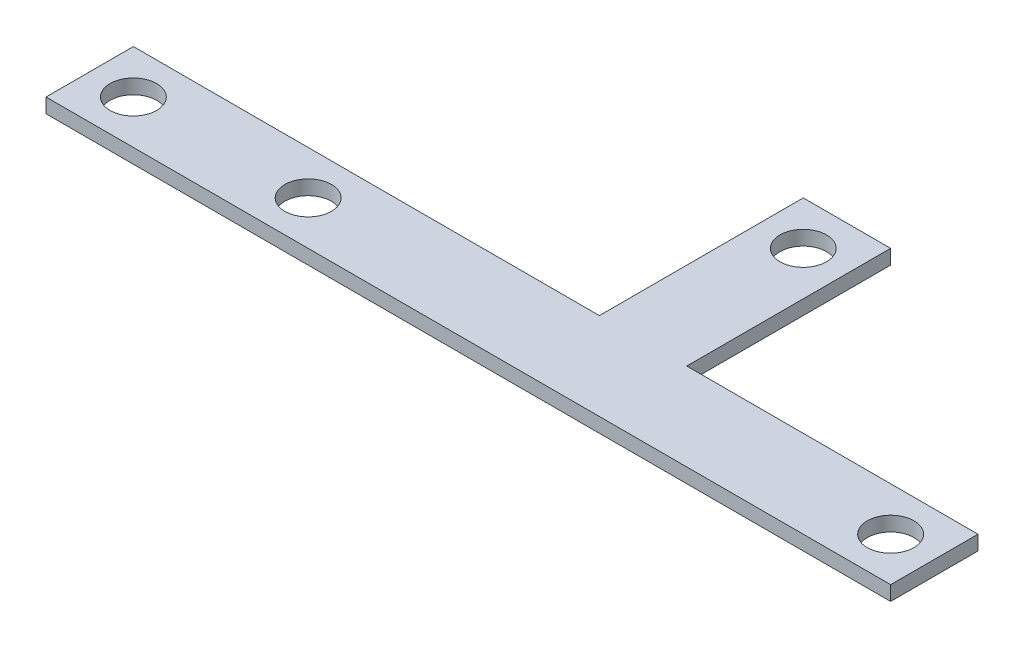
ISO-10303-21;
HEADER;
FILE_DESCRIPTION(('STEP AP214'),'2;1');
FILE_NAME('part.step','',(''),(''),'','','');
FILE_SCHEMA(('AUTOMOTIVE_DESIGN { 1 0 10303 214 1 1 1 1 }'));
ENDSEC;
DATA;
#1=APPLICATION_CONTEXT('core data for automotive mechanical design processes');
#2=APPLICATION_PROTOCOL_DEFINITION('international standard','automotive_design',2000,#1);
#3=PRODUCT_CONTEXT('',#1,'mechanical');
#4=PRODUCT('Part','Part','',(#3));
#5=PRODUCT_RELATED_PRODUCT_CATEGORY('part','',(#4));
#6=PRODUCT_DEFINITION_FORMATION('','',#4);
#7=PRODUCT_DEFINITION_CONTEXT('part definition',#1,'design');
#8=PRODUCT_DEFINITION('design','',#6,#7);
#9=PRODUCT_DEFINITION_SHAPE('','',#8);
#10=(LENGTH_UNIT() NAMED_UNIT(*) SI_UNIT(.MILLI.,.METRE.));
#11=(NAMED_UNIT(*) PLANE_ANGLE_UNIT() SI_UNIT($,.RADIAN.));
#12=(NAMED_UNIT(*) SI_UNIT($,.STERADIAN.) SOLID_ANGLE_UNIT());
#13=UNCERTAINTY_MEASURE_WITH_UNIT(LENGTH_MEASURE(1.E-05),#10,'distance_accuracy_value','');
#14=(GEOMETRIC_REPRESENTATION_CONTEXT(3) GLOBAL_UNCERTAINTY_ASSIGNED_CONTEXT((#13)) GLOBAL_UNIT_ASSIGNED_CONTEXT((#10,
#11,#12)) REPRESENTATION_CONTEXT('',''));
#15=CARTESIAN_POINT('',(0.,0.,0.));
#16=DIRECTION('',(0.,0.,1.));
#17=DIRECTION('',(1.,0.,0.));
#18=AXIS2_PLACEMENT_3D('',#15,#16,#17);
#19=CARTESIAN_POINT('',(0.,5.,0.));
#20=DIRECTION('',(0.,0.,-1.));
#21=DIRECTION('',(-1.,0.,0.));
#22=AXIS2_PLACEMENT_3D('',#19,#20,#21);
#23=PLANE('',#22);
#24=DIRECTION('',(1.,0.,0.));
#25=VECTOR('',#24,1.);
#26=CARTESIAN_POINT('',(0.,0.,0.));
#27=LINE('',#26,#25);
#28=CARTESIAN_POINT('',(0.,0.,0.));
#29=VERTEX_POINT('',#28);
#30=CARTESIAN_POINT('',(160.,0.,0.));
#31=VERTEX_POINT('',#30);
#32=EDGE_CURVE('E167',#29,#31,#27,.T.);
#33=ORIENTED_EDGE('',*,*,#32,.F.);
#34=DIRECTION('',(0.,-1.,0.));
#35=VECTOR('',#34,1.);
#36=CARTESIAN_POINT('',(0.,5.,0.));
#37=LINE('',#36,#35);
#38=CARTESIAN_POINT('',(0.,5.,0.));
#39=VERTEX_POINT('',#38);
#40=EDGE_CURVE('E187',#39,#29,#37,.T.);
#41=ORIENTED_EDGE('',*,*,#40,.F.);
#42=DIRECTION('',(1.,0.,0.));
#43=VECTOR('',#42,1.);
#44=CARTESIAN_POINT('',(0.,5.,0.));
#45=LINE('',#44,#43);
#46=CARTESIAN_POINT('',(160.,5.,0.));
#47=VERTEX_POINT('',#46);
#48=EDGE_CURVE('E224',#39,#47,#45,.T.);
#49=ORIENTED_EDGE('',*,*,#48,.T.);
#50=DIRECTION('',(0.,-1.,0.));
#51=VECTOR('',#50,1.);
#52=CARTESIAN_POINT('',(160.,5.,0.));
#53=LINE('',#52,#51);
#54=EDGE_CURVE('E102',#47,#31,#53,.T.);
#55=ORIENTED_EDGE('',*,*,#54,.T.);
#56=EDGE_LOOP('',(#33,#41,#49,#55));
#57=FACE_BOUND('',#56,.T.);
#58=ADVANCED_FACE('F92',(#57),#23,.T.);
#59=CARTESIAN_POINT('',(0.,5.,0.));
#60=DIRECTION('',(1.,0.,0.));
#61=DIRECTION('',(0.,0.,-1.));
#62=AXIS2_PLACEMENT_3D('',#59,#60,#61);
#63=PLANE('',#62);
#64=DIRECTION('',(0.,0.,1.));
#65=VECTOR('',#64,1.);
#66=CARTESIAN_POINT('',(0.,0.,0.));
#67=LINE('',#66,#65);
#68=CARTESIAN_POINT('',(0.,0.,30.));
#69=VERTEX_POINT('',#68);
#70=EDGE_CURVE('E203',#29,#69,#67,.T.);
#71=ORIENTED_EDGE('',*,*,#70,.T.);
#72=DIRECTION('',(0.,-1.,0.));
#73=VECTOR('',#72,1.);
#74=CARTESIAN_POINT('',(0.,5.,30.));
#75=LINE('',#74,#73);
#76=CARTESIAN_POINT('',(0.,5.,30.));
#77=VERTEX_POINT('',#76);
#78=EDGE_CURVE('E189',#77,#69,#75,.T.);
#79=ORIENTED_EDGE('',*,*,#78,.F.);
#80=DIRECTION('',(0.,0.,1.));
#81=VECTOR('',#80,1.);
#82=CARTESIAN_POINT('',(0.,5.,0.));
#83=LINE('',#82,#81);
#84=EDGE_CURVE('E221',#39,#77,#83,.T.);
#85=ORIENTED_EDGE('',*,*,#84,.F.);
#86=ORIENTED_EDGE('',*,*,#40,.T.);
#87=EDGE_LOOP('',(#71,#79,#85,#86));
#88=FACE_BOUND('',#87,.T.);
#89=ADVANCED_FACE('F265',(#88),#63,.F.);
#90=CARTESIAN_POINT('',(0.,5.,30.));
#91=DIRECTION('',(0.,0.,-1.));
#92=DIRECTION('',(-1.,0.,0.));
#93=AXIS2_PLACEMENT_3D('',#90,#91,#92);
#94=PLANE('',#93);
#95=DIRECTION('',(1.,0.,0.));
#96=VECTOR('',#95,1.);
#97=CARTESIAN_POINT('',(0.,0.,30.));
#98=LINE('',#97,#96);
#99=CARTESIAN_POINT('',(290.,0.,30.));
#100=VERTEX_POINT('',#99);
#101=EDGE_CURVE('E200',#69,#100,#98,.T.);
#102=ORIENTED_EDGE('',*,*,#101,.T.);
#103=DIRECTION('',(0.,-1.,0.));
#104=VECTOR('',#103,1.);
#105=CARTESIAN_POINT('',(290.,5.,30.));
#106=LINE('',#105,#104);
#107=CARTESIAN_POINT('',(290.,5.,30.));
#108=VERTEX_POINT('',#107);
#109=EDGE_CURVE('E192',#108,#100,#106,.T.);
#110=ORIENTED_EDGE('',*,*,#109,.F.);
#111=DIRECTION('',(1.,0.,0.));
#112=VECTOR('',#111,1.);
#113=CARTESIAN_POINT('',(0.,5.,30.));
#114=LINE('',#113,#112);
#115=EDGE_CURVE('E219',#77,#108,#114,.T.);
#116=ORIENTED_EDGE('',*,*,#115,.F.);
#117=ORIENTED_EDGE('',*,*,#78,.T.);
#118=EDGE_LOOP('',(#102,#110,#116,#117));
#119=FACE_BOUND('',#118,.T.);
#120=ADVANCED_FACE('F272',(#119),#94,.F.);
#121=CARTESIAN_POINT('',(290.,5.,0.));
#122=DIRECTION('',(1.,0.,0.));
#123=DIRECTION('',(0.,0.,-1.));
#124=AXIS2_PLACEMENT_3D('',#121,#122,#123);
#125=PLANE('',#124);
#126=DIRECTION('',(0.,0.,1.));
#127=VECTOR('',#126,1.);
#128=CARTESIAN_POINT('',(290.,0.,0.));
#129=LINE('',#128,#127);
#130=CARTESIAN_POINT('',(290.,0.,0.));
#131=VERTEX_POINT('',#130);
#132=EDGE_CURVE('E196',#131,#100,#129,.T.);
#133=ORIENTED_EDGE('',*,*,#132,.F.);
#134=DIRECTION('',(0.,-1.,0.));
#135=VECTOR('',#134,1.);
#136=CARTESIAN_POINT('',(290.,5.,0.));
#137=LINE('',#136,#135);
#138=CARTESIAN_POINT('',(290.,5.,0.));
#139=VERTEX_POINT('',#138);
#140=EDGE_CURVE('E111',#139,#131,#137,.T.);
#141=ORIENTED_EDGE('',*,*,#140,.F.);
#142=DIRECTION('',(0.,0.,1.));
#143=VECTOR('',#142,1.);
#144=CARTESIAN_POINT('',(290.,5.,0.));
#145=LINE('',#144,#143);
#146=EDGE_CURVE('E195',#139,#108,#145,.T.);
#147=ORIENTED_EDGE('',*,*,#146,.T.);
#148=ORIENTED_EDGE('',*,*,#109,.T.);
#149=EDGE_LOOP('',(#133,#141,#147,#148));
#150=FACE_BOUND('',#149,.T.);
#151=ADVANCED_FACE('F278',(#150),#125,.T.);
#152=CARTESIAN_POINT('',(190.,0.,0.));
#153=VERTEX_POINT('',#152);
#154=EDGE_CURVE('E206',#153,#131,#27,.T.);
#155=ORIENTED_EDGE('',*,*,#154,.F.);
#156=DIRECTION('',(0.,-1.,0.));
#157=VECTOR('',#156,1.);
#158=CARTESIAN_POINT('',(190.,5.,0.));
#159=LINE('',#158,#157);
#160=CARTESIAN_POINT('',(190.,5.,0.));
#161=VERTEX_POINT('',#160);
#162=EDGE_CURVE('E12',#161,#153,#159,.T.);
#163=ORIENTED_EDGE('',*,*,#162,.F.);
#164=EDGE_CURVE('E225',#161,#139,#45,.T.);
#165=ORIENTED_EDGE('',*,*,#164,.T.);
#166=ORIENTED_EDGE('',*,*,#140,.T.);
#167=EDGE_LOOP('',(#155,#163,#165,#166));
#168=FACE_BOUND('',#167,.T.);
#169=ADVANCED_FACE('F268',(#168),#23,.T.);
#170=CARTESIAN_POINT('',(15.,5.,15.));
#171=DIRECTION('',(0.,-1.,0.));
#172=DIRECTION('',(0.,0.,-1.));
#173=AXIS2_PLACEMENT_3D('',#170,#171,#172);
#174=CYLINDRICAL_SURFACE('',#173,8.00000000000001);
#175=CARTESIAN_POINT('',(15.,5.,15.));
#176=DIRECTION('',(0.,1.,0.));
#177=DIRECTION('',(0.,0.,1.));
#178=AXIS2_PLACEMENT_3D('',#175,#176,#177);
#179=CIRCLE('',#178,8.00000000000001);
#180=CARTESIAN_POINT('',(15.,5.,23.0000000000001));
#181=VERTEX_POINT('',#180);
#182=EDGE_CURVE('E227',#181,#181,#179,.T.);
#183=ORIENTED_EDGE('',*,*,#182,.T.);
#184=EDGE_LOOP('',(#183));
#185=FACE_BOUND('',#184,.T.);
#186=CARTESIAN_POINT('',(15.,0.,15.));
#187=DIRECTION('',(0.,1.,0.));
#188=DIRECTION('',(0.,0.,1.));
#189=AXIS2_PLACEMENT_3D('',#186,#187,#188);
#190=CIRCLE('',#189,8.00000000000001);
#191=CARTESIAN_POINT('',(15.,0.,23.0000000000001));
#192=VERTEX_POINT('',#191);
#193=EDGE_CURVE('E209',#192,#192,#190,.T.);
#194=ORIENTED_EDGE('',*,*,#193,.F.);
#195=EDGE_LOOP('',(#194));
#196=FACE_BOUND('',#195,.T.);
#197=ADVANCED_FACE('F277',(#185,#196),#174,.F.);
#198=CARTESIAN_POINT('',(275.,5.,15.));
#199=DIRECTION('',(0.,-1.,0.));
#200=DIRECTION('',(0.,0.,-1.));
#201=AXIS2_PLACEMENT_3D('',#198,#199,#200);
#202=CYLINDRICAL_SURFACE('',#201,7.99999999999998);
#203=CARTESIAN_POINT('',(275.,5.,15.));
#204=DIRECTION('',(0.,1.,0.));
#205=DIRECTION('',(0.,0.,1.));
#206=AXIS2_PLACEMENT_3D('',#203,#204,#205);
#207=CIRCLE('',#206,7.99999999999998);
#208=CARTESIAN_POINT('',(275.,5.,23.));
#209=VERTEX_POINT('',#208);
#210=EDGE_CURVE('E230',#209,#209,#207,.T.);
#211=ORIENTED_EDGE('',*,*,#210,.T.);
#212=EDGE_LOOP('',(#211));
#213=FACE_BOUND('',#212,.T.);
#214=CARTESIAN_POINT('',(275.,0.,15.));
#215=DIRECTION('',(0.,1.,0.));
#216=DIRECTION('',(0.,0.,1.));
#217=AXIS2_PLACEMENT_3D('',#214,#215,#216);
#218=CIRCLE('',#217,7.99999999999998);
#219=CARTESIAN_POINT('',(275.,0.,23.));
#220=VERTEX_POINT('',#219);
#221=EDGE_CURVE('E212',#220,#220,#218,.T.);
#222=ORIENTED_EDGE('',*,*,#221,.F.);
#223=EDGE_LOOP('',(#222));
#224=FACE_BOUND('',#223,.T.);
#225=ADVANCED_FACE('F261',(#213,#224),#202,.F.);
#226=CARTESIAN_POINT('',(75.,5.,15.));
#227=DIRECTION('',(0.,-1.,0.));
#228=DIRECTION('',(0.,0.,-1.));
#229=AXIS2_PLACEMENT_3D('',#226,#227,#228);
#230=CYLINDRICAL_SURFACE('',#229,8.00000000000001);
#231=CARTESIAN_POINT('',(75.,5.,15.));
#232=DIRECTION('',(0.,1.,0.));
#233=DIRECTION('',(0.,0.,1.));
#234=AXIS2_PLACEMENT_3D('',#231,#232,#233);
#235=CIRCLE('',#234,8.00000000000001);
#236=CARTESIAN_POINT('',(75.,5.,23.0000000000001));
#237=VERTEX_POINT('',#236);
#238=EDGE_CURVE('E199',#237,#237,#235,.T.);
#239=ORIENTED_EDGE('',*,*,#238,.T.);
#240=EDGE_LOOP('',(#239));
#241=FACE_BOUND('',#240,.T.);
#242=CARTESIAN_POINT('',(75.,0.,15.));
#243=DIRECTION('',(0.,1.,0.));
#244=DIRECTION('',(0.,0.,1.));
#245=AXIS2_PLACEMENT_3D('',#242,#243,#244);
#246=CIRCLE('',#245,8.00000000000001);
#247=CARTESIAN_POINT('',(75.,0.,23.0000000000001));
#248=VERTEX_POINT('',#247);
#249=EDGE_CURVE('E215',#248,#248,#246,.T.);
#250=ORIENTED_EDGE('',*,*,#249,.F.);
#251=EDGE_LOOP('',(#250));
#252=FACE_BOUND('',#251,.T.);
#253=ADVANCED_FACE('F236',(#241,#252),#230,.F.);
#254=CARTESIAN_POINT('',(0.,0.,0.));
#255=DIRECTION('',(0.,1.,0.));
#256=DIRECTION('',(0.,0.,1.));
#257=AXIS2_PLACEMENT_3D('',#254,#255,#256);
#258=PLANE('',#257);
#259=DIRECTION('',(0.,0.,1.));
#260=VECTOR('',#259,1.);
#261=CARTESIAN_POINT('',(190.,0.,-70.));
#262=LINE('',#261,#260);
#263=CARTESIAN_POINT('',(190.,0.,-70.));
#264=VERTEX_POINT('',#263);
#265=EDGE_CURVE('E171',#264,#153,#262,.T.);
#266=ORIENTED_EDGE('',*,*,#265,.T.);
#267=ORIENTED_EDGE('',*,*,#154,.T.);
#268=ORIENTED_EDGE('',*,*,#132,.T.);
#269=ORIENTED_EDGE('',*,*,#101,.F.);
#270=ORIENTED_EDGE('',*,*,#70,.F.);
#271=ORIENTED_EDGE('',*,*,#32,.T.);
#272=DIRECTION('',(0.,0.,1.));
#273=VECTOR('',#272,1.);
#274=CARTESIAN_POINT('',(160.,0.,-70.));
#275=LINE('',#274,#273);
#276=CARTESIAN_POINT('',(160.,0.,-70.));
#277=VERTEX_POINT('',#276);
#278=EDGE_CURVE('E154',#277,#31,#275,.T.);
#279=ORIENTED_EDGE('',*,*,#278,.F.);
#280=DIRECTION('',(1.,0.,0.));
#281=VECTOR('',#280,1.);
#282=CARTESIAN_POINT('',(160.,0.,-70.));
#283=LINE('',#282,#281);
#284=EDGE_CURVE('E164',#277,#264,#283,.T.);
#285=ORIENTED_EDGE('',*,*,#284,.T.);
#286=EDGE_LOOP('',(#266,#267,#268,#269,#270,#271,#279,#285));
#287=FACE_BOUND('',#286,.T.);
#288=ORIENTED_EDGE('',*,*,#249,.T.);
#289=EDGE_LOOP('',(#288));
#290=FACE_BOUND('',#289,.T.);
#291=ORIENTED_EDGE('',*,*,#221,.T.);
#292=EDGE_LOOP('',(#291));
#293=FACE_BOUND('',#292,.T.);
#294=ORIENTED_EDGE('',*,*,#193,.T.);
#295=EDGE_LOOP('',(#294));
#296=FACE_BOUND('',#295,.T.);
#297=CARTESIAN_POINT('',(175.,0.,-55.));
#298=DIRECTION('',(0.,1.,0.));
#299=DIRECTION('',(0.,0.,1.));
#300=AXIS2_PLACEMENT_3D('',#297,#298,#299);
#301=CIRCLE('',#300,8.00000000000004);
#302=CARTESIAN_POINT('',(175.,0.,-47.));
#303=VERTEX_POINT('',#302);
#304=EDGE_CURVE('E181',#303,#303,#301,.T.);
#305=ORIENTED_EDGE('',*,*,#304,.T.);
#306=EDGE_LOOP('',(#305));
#307=FACE_BOUND('',#306,.T.);
#308=ADVANCED_FACE('F162',(#287,#290,#293,#296,#307),#258,.F.);
#309=CARTESIAN_POINT('',(0.,5.,0.));
#310=DIRECTION('',(0.,1.,0.));
#311=DIRECTION('',(0.,0.,1.));
#312=AXIS2_PLACEMENT_3D('',#309,#310,#311);
#313=PLANE('',#312);
#314=ORIENTED_EDGE('',*,*,#164,.F.);
#315=DIRECTION('',(0.,0.,1.));
#316=VECTOR('',#315,1.);
#317=CARTESIAN_POINT('',(190.,5.,-70.));
#318=LINE('',#317,#316);
#319=CARTESIAN_POINT('',(190.,5.,-70.));
#320=VERTEX_POINT('',#319);
#321=EDGE_CURVE('E168',#320,#161,#318,.T.);
#322=ORIENTED_EDGE('',*,*,#321,.F.);
#323=DIRECTION('',(1.,0.,0.));
#324=VECTOR('',#323,1.);
#325=CARTESIAN_POINT('',(160.,5.,-70.));
#326=LINE('',#325,#324);
#327=CARTESIAN_POINT('',(160.,5.,-70.));
#328=VERTEX_POINT('',#327);
#329=EDGE_CURVE('E177',#328,#320,#326,.T.);
#330=ORIENTED_EDGE('',*,*,#329,.F.);
#331=DIRECTION('',(0.,0.,1.));
#332=VECTOR('',#331,1.);
#333=CARTESIAN_POINT('',(160.,5.,-70.));
#334=LINE('',#333,#332);
#335=EDGE_CURVE('E157',#328,#47,#334,.T.);
#336=ORIENTED_EDGE('',*,*,#335,.T.);
#337=ORIENTED_EDGE('',*,*,#48,.F.);
#338=ORIENTED_EDGE('',*,*,#84,.T.);
#339=ORIENTED_EDGE('',*,*,#115,.T.);
#340=ORIENTED_EDGE('',*,*,#146,.F.);
#341=EDGE_LOOP('',(#314,#322,#330,#336,#337,#338,#339,#340));
#342=FACE_BOUND('',#341,.T.);
#343=ORIENTED_EDGE('',*,*,#238,.F.);
#344=EDGE_LOOP('',(#343));
#345=FACE_BOUND('',#344,.T.);
#346=ORIENTED_EDGE('',*,*,#210,.F.);
#347=EDGE_LOOP('',(#346));
#348=FACE_BOUND('',#347,.T.);
#349=ORIENTED_EDGE('',*,*,#182,.F.);
#350=EDGE_LOOP('',(#349));
#351=FACE_BOUND('',#350,.T.);
#352=CARTESIAN_POINT('',(175.,5.,-55.));
#353=DIRECTION('',(0.,1.,0.));
#354=DIRECTION('',(0.,0.,1.));
#355=AXIS2_PLACEMENT_3D('',#352,#353,#354);
#356=CIRCLE('',#355,8.00000000000004);
#357=CARTESIAN_POINT('',(175.,5.,-47.));
#358=VERTEX_POINT('',#357);
#359=EDGE_CURVE('E173',#358,#358,#356,.T.);
#360=ORIENTED_EDGE('',*,*,#359,.F.);
#361=EDGE_LOOP('',(#360));
#362=FACE_BOUND('',#361,.T.);
#363=ADVANCED_FACE('F239',(#342,#345,#348,#351,#362),#313,.T.);
#364=CARTESIAN_POINT('',(175.,5.,-55.));
#365=DIRECTION('',(0.,-1.,0.));
#366=DIRECTION('',(0.,0.,-1.));
#367=AXIS2_PLACEMENT_3D('',#364,#365,#366);
#368=CYLINDRICAL_SURFACE('',#367,8.00000000000004);
#369=ORIENTED_EDGE('',*,*,#359,.T.);
#370=EDGE_LOOP('',(#369));
#371=FACE_BOUND('',#370,.T.);
#372=ORIENTED_EDGE('',*,*,#304,.F.);
#373=EDGE_LOOP('',(#372));
#374=FACE_BOUND('',#373,.T.);
#375=ADVANCED_FACE('F242',(#371,#374),#368,.F.);
#376=CARTESIAN_POINT('',(190.,5.,-70.));
#377=DIRECTION('',(1.,0.,0.));
#378=DIRECTION('',(0.,0.,-1.));
#379=AXIS2_PLACEMENT_3D('',#376,#377,#378);
#380=PLANE('',#379);
#381=ORIENTED_EDGE('',*,*,#321,.T.);
#382=ORIENTED_EDGE('',*,*,#162,.T.);
#383=ORIENTED_EDGE('',*,*,#265,.F.);
#384=DIRECTION('',(0.,-1.,0.));
#385=VECTOR('',#384,1.);
#386=CARTESIAN_POINT('',(190.,5.,-70.));
#387=LINE('',#386,#385);
#388=EDGE_CURVE('E96',#320,#264,#387,.T.);
#389=ORIENTED_EDGE('',*,*,#388,.F.);
#390=EDGE_LOOP('',(#381,#382,#383,#389));
#391=FACE_BOUND('',#390,.T.);
#392=ADVANCED_FACE('F94',(#391),#380,.T.);
#393=CARTESIAN_POINT('',(160.,5.,-70.));
#394=DIRECTION('',(0.,0.,-1.));
#395=DIRECTION('',(-1.,0.,0.));
#396=AXIS2_PLACEMENT_3D('',#393,#394,#395);
#397=PLANE('',#396);
#398=ORIENTED_EDGE('',*,*,#284,.F.);
#399=DIRECTION('',(0.,-1.,0.));
#400=VECTOR('',#399,1.);
#401=CARTESIAN_POINT('',(160.,5.,-70.));
#402=LINE('',#401,#400);
#403=EDGE_CURVE('E150',#328,#277,#402,.T.);
#404=ORIENTED_EDGE('',*,*,#403,.F.);
#405=ORIENTED_EDGE('',*,*,#329,.T.);
#406=ORIENTED_EDGE('',*,*,#388,.T.);
#407=EDGE_LOOP('',(#398,#404,#405,#406));
#408=FACE_BOUND('',#407,.T.);
#409=ADVANCED_FACE('F170',(#408),#397,.T.);
#410=CARTESIAN_POINT('',(160.,5.,-70.));
#411=DIRECTION('',(1.,0.,0.));
#412=DIRECTION('',(0.,0.,-1.));
#413=AXIS2_PLACEMENT_3D('',#410,#411,#412);
#414=PLANE('',#413);
#415=ORIENTED_EDGE('',*,*,#54,.F.);
#416=ORIENTED_EDGE('',*,*,#335,.F.);
#417=ORIENTED_EDGE('',*,*,#403,.T.);
#418=ORIENTED_EDGE('',*,*,#278,.T.);
#419=EDGE_LOOP('',(#415,#416,#417,#418));
#420=FACE_BOUND('',#419,.T.);
#421=ADVANCED_FACE('F153',(#420),#414,.F.);
#422=CLOSED_SHELL('',(#58,#89,#120,#151,#169,#197,#225,#253,#308,#363,#375,#392,#409,#421));
#423=MANIFOLD_SOLID_BREP('B2',#422);
#424=ADVANCED_BREP_SHAPE_REPRESENTATION('',(#18,#423),#14);
#425=SHAPE_DEFINITION_REPRESENTATION(#9,#424);
ENDSEC;
END-ISO-10303-21;
